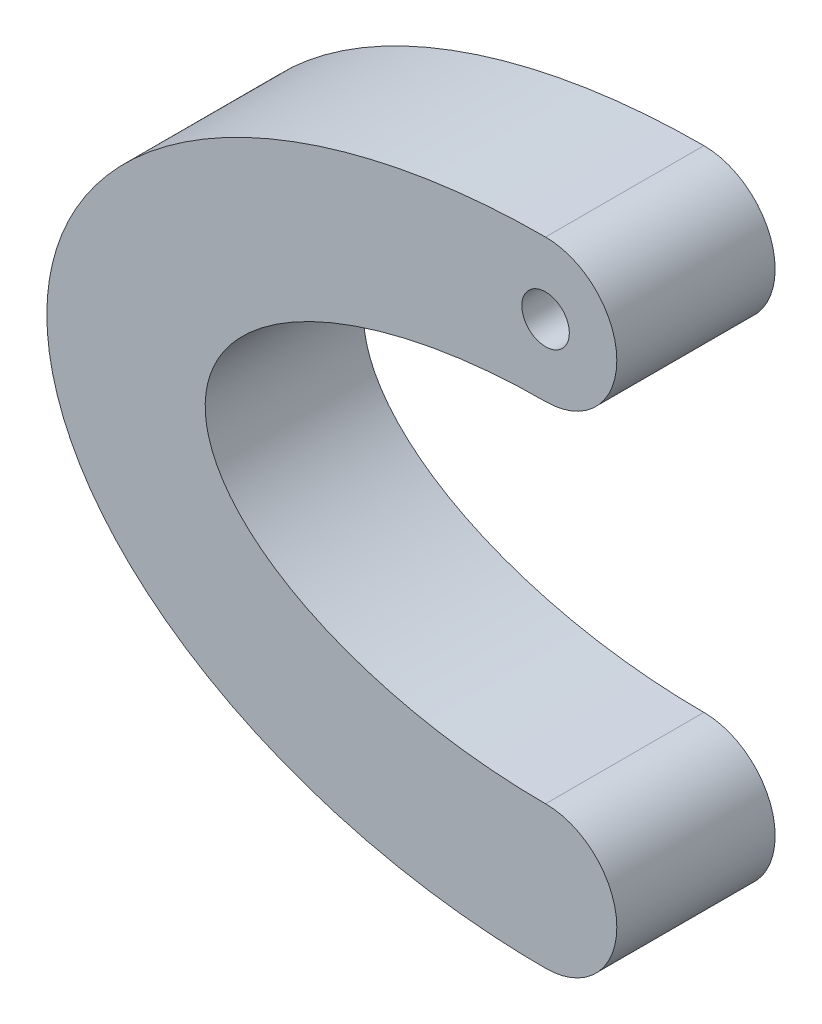
ISO-10303-21;
HEADER;
FILE_DESCRIPTION(('STEP AP214'),'2;1');
FILE_NAME('part.step','',(''),(''),'','','');
FILE_SCHEMA(('AUTOMOTIVE_DESIGN { 1 0 10303 214 1 1 1 1 }'));
ENDSEC;
DATA;
#1=APPLICATION_CONTEXT('core data for automotive mechanical design processes');
#2=APPLICATION_PROTOCOL_DEFINITION('international standard','automotive_design',2000,#1);
#3=PRODUCT_CONTEXT('',#1,'mechanical');
#4=PRODUCT('Part','Part','',(#3));
#5=PRODUCT_RELATED_PRODUCT_CATEGORY('part','',(#4));
#6=PRODUCT_DEFINITION_FORMATION('','',#4);
#7=PRODUCT_DEFINITION_CONTEXT('part definition',#1,'design');
#8=PRODUCT_DEFINITION('design','',#6,#7);
#9=PRODUCT_DEFINITION_SHAPE('','',#8);
#10=(LENGTH_UNIT() NAMED_UNIT(*) SI_UNIT(.MILLI.,.METRE.));
#11=(NAMED_UNIT(*) PLANE_ANGLE_UNIT() SI_UNIT($,.RADIAN.));
#12=(NAMED_UNIT(*) SI_UNIT($,.STERADIAN.) SOLID_ANGLE_UNIT());
#13=UNCERTAINTY_MEASURE_WITH_UNIT(LENGTH_MEASURE(1.E-05),#10,'distance_accuracy_value','');
#14=(GEOMETRIC_REPRESENTATION_CONTEXT(3) GLOBAL_UNCERTAINTY_ASSIGNED_CONTEXT((#13)) GLOBAL_UNIT_ASSIGNED_CONTEXT((#10,
#11,#12)) REPRESENTATION_CONTEXT('',''));
#15=CARTESIAN_POINT('',(0.,0.,0.));
#16=DIRECTION('',(0.,0.,1.));
#17=DIRECTION('',(1.,0.,0.));
#18=AXIS2_PLACEMENT_3D('',#15,#16,#17);
#19=CARTESIAN_POINT('',(0.,0.,-10.));
#20=DIRECTION('',(0.,0.,-1.));
#21=DIRECTION('',(-1.,0.,0.));
#22=AXIS2_PLACEMENT_3D('',#19,#20,#21);
#23=ELLIPSE('',#22,21.5,11.);
#24=DIRECTION('',(0.,0.,1.));
#25=VECTOR('',#24,1.);
#26=SURFACE_OF_LINEAR_EXTRUSION('',#23,#25);
#27=CARTESIAN_POINT('',(0.,0.,0.));
#28=DIRECTION('',(0.,0.,-1.));
#29=DIRECTION('',(-1.,0.,0.));
#30=AXIS2_PLACEMENT_3D('',#27,#28,#29);
#31=ELLIPSE('',#30,21.5,11.);
#32=CARTESIAN_POINT('',(0.,-11.,0.));
#33=VERTEX_POINT('',#32);
#34=CARTESIAN_POINT('',(0.,11.,0.));
#35=VERTEX_POINT('',#34);
#36=EDGE_CURVE('E140',#33,#35,#31,.T.);
#37=ORIENTED_EDGE('',*,*,#36,.F.);
#38=DIRECTION('',(0.,0.,1.));
#39=VECTOR('',#38,1.);
#40=CARTESIAN_POINT('',(0.,-11.,-10.));
#41=LINE('',#40,#39);
#42=CARTESIAN_POINT('',(0.,-11.,-10.));
#43=VERTEX_POINT('',#42);
#44=EDGE_CURVE('E11',#43,#33,#41,.T.);
#45=ORIENTED_EDGE('',*,*,#44,.F.);
#46=CARTESIAN_POINT('',(0.,11.,-10.));
#47=VERTEX_POINT('',#46);
#48=EDGE_CURVE('E100',#43,#47,#23,.T.);
#49=ORIENTED_EDGE('',*,*,#48,.T.);
#50=DIRECTION('',(0.,0.,1.));
#51=VECTOR('',#50,1.);
#52=CARTESIAN_POINT('',(0.,11.,-10.));
#53=LINE('',#52,#51);
#54=EDGE_CURVE('E45',#47,#35,#53,.T.);
#55=ORIENTED_EDGE('',*,*,#54,.T.);
#56=EDGE_LOOP('',(#37,#45,#49,#55));
#57=FACE_BOUND('',#56,.T.);
#58=ADVANCED_FACE('F41',(#57),#26,.T.);
#59=CARTESIAN_POINT('',(0.,-15.5,-10.));
#60=DIRECTION('',(0.,0.,1.));
#61=DIRECTION('',(1.,0.,0.));
#62=AXIS2_PLACEMENT_3D('',#59,#60,#61);
#63=CYLINDRICAL_SURFACE('',#62,4.5);
#64=CARTESIAN_POINT('',(0.,-15.5,0.));
#65=DIRECTION('',(0.,0.,1.));
#66=DIRECTION('',(1.,0.,0.));
#67=AXIS2_PLACEMENT_3D('',#64,#65,#66);
#68=CIRCLE('',#67,4.5);
#69=CARTESIAN_POINT('',(0.,-20.,0.));
#70=VERTEX_POINT('',#69);
#71=EDGE_CURVE('E125',#70,#33,#68,.T.);
#72=ORIENTED_EDGE('',*,*,#71,.F.);
#73=DIRECTION('',(0.,0.,1.));
#74=VECTOR('',#73,1.);
#75=CARTESIAN_POINT('',(0.,-20.,-10.));
#76=LINE('',#75,#74);
#77=CARTESIAN_POINT('',(0.,-20.,-10.));
#78=VERTEX_POINT('',#77);
#79=EDGE_CURVE('E52',#78,#70,#76,.T.);
#80=ORIENTED_EDGE('',*,*,#79,.F.);
#81=CARTESIAN_POINT('',(0.,-15.5,-10.));
#82=DIRECTION('',(0.,0.,1.));
#83=DIRECTION('',(1.,0.,0.));
#84=AXIS2_PLACEMENT_3D('',#81,#82,#83);
#85=CIRCLE('',#84,4.5);
#86=EDGE_CURVE('E103',#78,#43,#85,.T.);
#87=ORIENTED_EDGE('',*,*,#86,.T.);
#88=ORIENTED_EDGE('',*,*,#44,.T.);
#89=EDGE_LOOP('',(#72,#80,#87,#88));
#90=FACE_BOUND('',#89,.T.);
#91=ADVANCED_FACE('F115',(#90),#63,.T.);
#92=CARTESIAN_POINT('',(0.,0.,-10.));
#93=DIRECTION('',(0.,0.,1.));
#94=DIRECTION('',(-1.,0.,0.));
#95=AXIS2_PLACEMENT_3D('',#92,#93,#94);
#96=ELLIPSE('',#95,31.5,20.);
#97=DIRECTION('',(0.,0.,1.));
#98=VECTOR('',#97,1.);
#99=SURFACE_OF_LINEAR_EXTRUSION('',#96,#98);
#100=CARTESIAN_POINT('',(0.,0.,0.));
#101=DIRECTION('',(0.,0.,1.));
#102=DIRECTION('',(-1.,0.,0.));
#103=AXIS2_PLACEMENT_3D('',#100,#101,#102);
#104=ELLIPSE('',#103,31.5,20.);
#105=CARTESIAN_POINT('',(0.,20.,0.));
#106=VERTEX_POINT('',#105);
#107=EDGE_CURVE('E93',#106,#70,#104,.T.);
#108=ORIENTED_EDGE('',*,*,#107,.F.);
#109=DIRECTION('',(0.,0.,1.));
#110=VECTOR('',#109,1.);
#111=CARTESIAN_POINT('',(0.,20.,-10.));
#112=LINE('',#111,#110);
#113=CARTESIAN_POINT('',(0.,20.,-10.));
#114=VERTEX_POINT('',#113);
#115=EDGE_CURVE('E89',#114,#106,#112,.T.);
#116=ORIENTED_EDGE('',*,*,#115,.F.);
#117=EDGE_CURVE('E91',#114,#78,#96,.T.);
#118=ORIENTED_EDGE('',*,*,#117,.T.);
#119=ORIENTED_EDGE('',*,*,#79,.T.);
#120=EDGE_LOOP('',(#108,#116,#118,#119));
#121=FACE_BOUND('',#120,.T.);
#122=ADVANCED_FACE('F90',(#121),#99,.T.);
#123=CARTESIAN_POINT('',(0.,15.5,-10.));
#124=DIRECTION('',(0.,0.,1.));
#125=DIRECTION('',(1.,0.,0.));
#126=AXIS2_PLACEMENT_3D('',#123,#124,#125);
#127=CYLINDRICAL_SURFACE('',#126,1.5);
#128=CARTESIAN_POINT('',(0.,15.5,-10.));
#129=DIRECTION('',(0.,0.,1.));
#130=DIRECTION('',(1.,0.,0.));
#131=AXIS2_PLACEMENT_3D('',#128,#129,#130);
#132=CIRCLE('',#131,1.5);
#133=CARTESIAN_POINT('',(1.50000000000001,15.5,-10.));
#134=VERTEX_POINT('',#133);
#135=EDGE_CURVE('E122',#134,#134,#132,.T.);
#136=ORIENTED_EDGE('',*,*,#135,.F.);
#137=EDGE_LOOP('',(#136));
#138=FACE_BOUND('',#137,.T.);
#139=CARTESIAN_POINT('',(0.,15.5,0.));
#140=DIRECTION('',(0.,0.,1.));
#141=DIRECTION('',(1.,0.,0.));
#142=AXIS2_PLACEMENT_3D('',#139,#140,#141);
#143=CIRCLE('',#142,1.5);
#144=CARTESIAN_POINT('',(1.50000000000001,15.5,0.));
#145=VERTEX_POINT('',#144);
#146=EDGE_CURVE('E144',#145,#145,#143,.T.);
#147=ORIENTED_EDGE('',*,*,#146,.T.);
#148=EDGE_LOOP('',(#147));
#149=FACE_BOUND('',#148,.T.);
#150=ADVANCED_FACE('F43',(#138,#149),#127,.F.);
#151=CARTESIAN_POINT('',(0.,15.5,-10.));
#152=DIRECTION('',(0.,0.,1.));
#153=DIRECTION('',(1.,0.,0.));
#154=AXIS2_PLACEMENT_3D('',#151,#152,#153);
#155=CYLINDRICAL_SURFACE('',#154,4.5);
#156=CARTESIAN_POINT('',(0.,15.5,0.));
#157=DIRECTION('',(0.,0.,1.));
#158=DIRECTION('',(1.,0.,0.));
#159=AXIS2_PLACEMENT_3D('',#156,#157,#158);
#160=CIRCLE('',#159,4.5);
#161=EDGE_CURVE('E134',#106,#35,#160,.F.);
#162=ORIENTED_EDGE('',*,*,#161,.T.);
#163=ORIENTED_EDGE('',*,*,#54,.F.);
#164=CARTESIAN_POINT('',(0.,15.5,-10.));
#165=DIRECTION('',(0.,0.,1.));
#166=DIRECTION('',(1.,0.,0.));
#167=AXIS2_PLACEMENT_3D('',#164,#165,#166);
#168=CIRCLE('',#167,4.5);
#169=EDGE_CURVE('E86',#114,#47,#168,.F.);
#170=ORIENTED_EDGE('',*,*,#169,.F.);
#171=ORIENTED_EDGE('',*,*,#115,.T.);
#172=EDGE_LOOP('',(#162,#163,#170,#171));
#173=FACE_BOUND('',#172,.T.);
#174=ADVANCED_FACE('F98',(#173),#155,.T.);
#175=CARTESIAN_POINT('',(0.,0.,-10.));
#176=DIRECTION('',(0.,0.,1.));
#177=DIRECTION('',(1.,0.,0.));
#178=AXIS2_PLACEMENT_3D('',#175,#176,#177);
#179=PLANE('',#178);
#180=ORIENTED_EDGE('',*,*,#135,.T.);
#181=EDGE_LOOP('',(#180));
#182=FACE_BOUND('',#181,.T.);
#183=ORIENTED_EDGE('',*,*,#48,.F.);
#184=ORIENTED_EDGE('',*,*,#86,.F.);
#185=ORIENTED_EDGE('',*,*,#117,.F.);
#186=ORIENTED_EDGE('',*,*,#169,.T.);
#187=EDGE_LOOP('',(#183,#184,#185,#186));
#188=FACE_BOUND('',#187,.T.);
#189=ADVANCED_FACE('F102',(#182,#188),#179,.F.);
#190=CARTESIAN_POINT('',(0.,0.,0.));
#191=DIRECTION('',(0.,0.,1.));
#192=DIRECTION('',(1.,0.,0.));
#193=AXIS2_PLACEMENT_3D('',#190,#191,#192);
#194=PLANE('',#193);
#195=ORIENTED_EDGE('',*,*,#146,.F.);
#196=EDGE_LOOP('',(#195));
#197=FACE_BOUND('',#196,.T.);
#198=ORIENTED_EDGE('',*,*,#36,.T.);
#199=ORIENTED_EDGE('',*,*,#161,.F.);
#200=ORIENTED_EDGE('',*,*,#107,.T.);
#201=ORIENTED_EDGE('',*,*,#71,.T.);
#202=EDGE_LOOP('',(#198,#199,#200,#201));
#203=FACE_BOUND('',#202,.T.);
#204=ADVANCED_FACE('F142',(#197,#203),#194,.T.);
#205=CLOSED_SHELL('',(#58,#91,#122,#150,#174,#189,#204));
#206=MANIFOLD_SOLID_BREP('B2',#205);
#207=ADVANCED_BREP_SHAPE_REPRESENTATION('',(#18,#206),#14);
#208=SHAPE_DEFINITION_REPRESENTATION(#9,#207);
ENDSEC;
END-ISO-10303-21;
